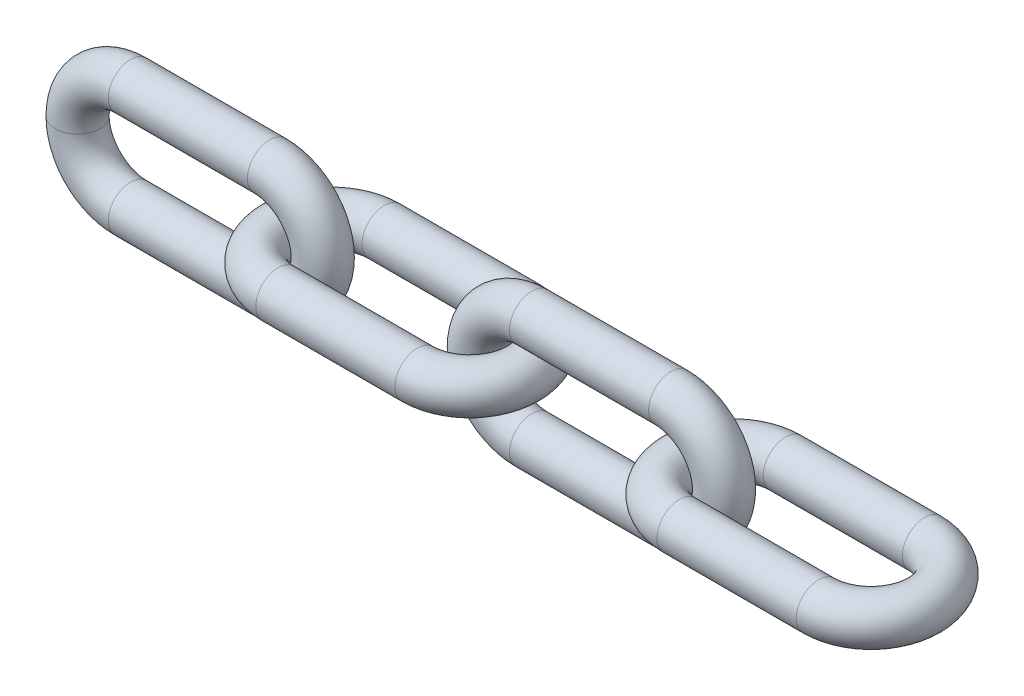
ISO-10303-21;
HEADER;
FILE_DESCRIPTION(('STEP AP214'),'2;1');
FILE_NAME('part.step','',(''),(''),'','','');
FILE_SCHEMA(('AUTOMOTIVE_DESIGN { 1 0 10303 214 1 1 1 1 }'));
ENDSEC;
DATA;
#1=APPLICATION_CONTEXT('core data for automotive mechanical design processes');
#2=APPLICATION_PROTOCOL_DEFINITION('international standard','automotive_design',2000,#1);
#3=PRODUCT_CONTEXT('',#1,'mechanical');
#4=PRODUCT('Part','Part','',(#3));
#5=PRODUCT_RELATED_PRODUCT_CATEGORY('part','',(#4));
#6=PRODUCT_DEFINITION_FORMATION('','',#4);
#7=PRODUCT_DEFINITION_CONTEXT('part definition',#1,'design');
#8=PRODUCT_DEFINITION('design','',#6,#7);
#9=PRODUCT_DEFINITION_SHAPE('','',#8);
#10=(LENGTH_UNIT() NAMED_UNIT(*) SI_UNIT(.MILLI.,.METRE.));
#11=(NAMED_UNIT(*) PLANE_ANGLE_UNIT() SI_UNIT($,.RADIAN.));
#12=(NAMED_UNIT(*) SI_UNIT($,.STERADIAN.) SOLID_ANGLE_UNIT());
#13=UNCERTAINTY_MEASURE_WITH_UNIT(LENGTH_MEASURE(1.E-05),#10,'distance_accuracy_value','');
#14=(GEOMETRIC_REPRESENTATION_CONTEXT(3) GLOBAL_UNCERTAINTY_ASSIGNED_CONTEXT((#13)) GLOBAL_UNIT_ASSIGNED_CONTEXT((#10,
#11,#12)) REPRESENTATION_CONTEXT('',''));
#15=CARTESIAN_POINT('',(0.,0.,0.));
#16=DIRECTION('',(0.,0.,1.));
#17=DIRECTION('',(1.,0.,0.));
#18=AXIS2_PLACEMENT_3D('',#15,#16,#17);
#19=CARTESIAN_POINT('',(83.566,0.,0.));
#20=DIRECTION('',(0.,0.999961923064166,0.00872653549903342));
#21=DIRECTION('',(-1.,0.,0.));
#22=AXIS2_PLACEMENT_3D('',#19,#20,#21);
#23=TOROIDAL_SURFACE('',#22,8.3312,3.5052);
#24=CARTESIAN_POINT('',(83.566,0.0727025125495473,-8.33088277343218));
#25=DIRECTION('',(-1.,0.,0.));
#26=DIRECTION('',(0.,-0.999961923064166,-0.00872653549903342));
#27=AXIS2_PLACEMENT_3D('',#24,#25,#26);
#28=CIRCLE('',#27,3.5052);
#29=CARTESIAN_POINT('',(83.566,0.103290764780759,-11.8359493061567));
#30=VERTEX_POINT('',#29);
#31=EDGE_CURVE('E11',#30,#30,#28,.T.);
#32=CARTESIAN_POINT('',(75.2348,0.,0.));
#33=DIRECTION('',(0.,-0.00872653549903342,0.999961923064166));
#34=DIRECTION('',(0.,-0.999961923064166,-0.00872653549903342));
#35=AXIS2_PLACEMENT_3D('',#32,#33,#34);
#36=CIRCLE('',#35,3.5052);
#37=CARTESIAN_POINT('',(71.7296,0.,0.));
#38=VERTEX_POINT('',#37);
#39=EDGE_CURVE('E69',#38,#38,#36,.T.);
#40=CARTESIAN_POINT('',(83.566,0.,0.));
#41=DIRECTION('',(0.,0.999961923064166,0.00872653549903342));
#42=DIRECTION('',(-1.,0.,0.));
#43=AXIS2_PLACEMENT_3D('',#40,#41,#42);
#44=CIRCLE('',#43,11.8364);
#45=EDGE_CURVE('',#30,#38,#44,.T.);
#46=ORIENTED_EDGE('',*,*,#31,.T.);
#47=ORIENTED_EDGE('',*,*,#39,.F.);
#48=ORIENTED_EDGE('',*,*,#45,.T.);
#49=ORIENTED_EDGE('',*,*,#45,.F.);
#50=EDGE_LOOP('',(#46,#48,#47,#49));
#51=FACE_BOUND('',#50,.T.);
#52=ADVANCED_FACE('F50',(#51),#23,.T.);
#53=CARTESIAN_POINT('',(105.41,0.0727025125495473,-8.33088277343218));
#54=DIRECTION('',(-1.,0.,0.));
#55=DIRECTION('',(0.,-0.999961923064166,-0.00872653549903342));
#56=AXIS2_PLACEMENT_3D('',#53,#54,#55);
#57=CYLINDRICAL_SURFACE('',#56,3.5052);
#58=ORIENTED_EDGE('',*,*,#31,.F.);
#59=EDGE_LOOP('',(#58));
#60=FACE_BOUND('',#59,.T.);
#61=CARTESIAN_POINT('',(105.41,0.0727025125495472,-8.33088277343218));
#62=DIRECTION('',(-1.,0.,0.));
#63=DIRECTION('',(0.,-0.999961923064166,-0.00872653549903342));
#64=AXIS2_PLACEMENT_3D('',#61,#62,#63);
#65=CIRCLE('',#64,3.5052);
#66=CARTESIAN_POINT('',(105.41,0.103290764780759,-11.8359493061567));
#67=VERTEX_POINT('',#66);
#68=EDGE_CURVE('E56',#67,#67,#65,.T.);
#69=ORIENTED_EDGE('',*,*,#68,.T.);
#70=EDGE_LOOP('',(#69));
#71=FACE_BOUND('',#70,.T.);
#72=ADVANCED_FACE('F76',(#60,#71),#57,.T.);
#73=CARTESIAN_POINT('',(105.41,0.,0.));
#74=DIRECTION('',(0.,0.999961923064166,0.00872653549903342));
#75=DIRECTION('',(-1.,0.,0.));
#76=AXIS2_PLACEMENT_3D('',#73,#74,#75);
#77=TOROIDAL_SURFACE('',#76,8.3312,3.5052);
#78=CARTESIAN_POINT('',(105.41,-0.0727025125495473,8.33088277343218));
#79=DIRECTION('',(1.,0.,0.));
#80=DIRECTION('',(0.,-0.999961923064166,-0.00872653549903342));
#81=AXIS2_PLACEMENT_3D('',#78,#79,#80);
#82=CIRCLE('',#81,3.5052);
#83=CARTESIAN_POINT('',(105.41,-0.103290764780759,11.8359493061567));
#84=VERTEX_POINT('',#83);
#85=EDGE_CURVE('E60',#84,#84,#82,.T.);
#86=CARTESIAN_POINT('',(105.41,0.,0.));
#87=DIRECTION('',(0.,0.999961923064166,0.00872653549903342));
#88=DIRECTION('',(-1.,0.,0.));
#89=AXIS2_PLACEMENT_3D('',#86,#87,#88);
#90=CIRCLE('',#89,11.8364);
#91=EDGE_CURVE('',#84,#67,#90,.T.);
#92=ORIENTED_EDGE('',*,*,#85,.T.);
#93=ORIENTED_EDGE('',*,*,#68,.F.);
#94=ORIENTED_EDGE('',*,*,#91,.T.);
#95=ORIENTED_EDGE('',*,*,#91,.F.);
#96=EDGE_LOOP('',(#92,#94,#93,#95));
#97=FACE_BOUND('',#96,.T.);
#98=ADVANCED_FACE('F80',(#97),#77,.T.);
#99=CARTESIAN_POINT('',(83.566,-0.0727025125495473,8.33088277343218));
#100=DIRECTION('',(1.,0.,0.));
#101=DIRECTION('',(0.,0.999961923064166,0.00872653549903342));
#102=AXIS2_PLACEMENT_3D('',#99,#100,#101);
#103=CYLINDRICAL_SURFACE('',#102,3.5052);
#104=ORIENTED_EDGE('',*,*,#85,.F.);
#105=EDGE_LOOP('',(#104));
#106=FACE_BOUND('',#105,.T.);
#107=CARTESIAN_POINT('',(83.566,-0.0727025125495473,8.33088277343218));
#108=DIRECTION('',(1.,0.,0.));
#109=DIRECTION('',(0.,-0.999961923064166,-0.00872653549903342));
#110=AXIS2_PLACEMENT_3D('',#107,#108,#109);
#111=CIRCLE('',#110,3.5052);
#112=CARTESIAN_POINT('',(83.566,-0.103290764780759,11.8359493061567));
#113=VERTEX_POINT('',#112);
#114=EDGE_CURVE('E64',#113,#113,#111,.T.);
#115=ORIENTED_EDGE('',*,*,#114,.T.);
#116=EDGE_LOOP('',(#115));
#117=FACE_BOUND('',#116,.T.);
#118=ADVANCED_FACE('F85',(#106,#117),#103,.T.);
#119=CARTESIAN_POINT('',(83.566,0.,0.));
#120=DIRECTION('',(0.,0.999961923064166,0.00872653549903342));
#121=DIRECTION('',(-1.,0.,0.));
#122=AXIS2_PLACEMENT_3D('',#119,#120,#121);
#123=TOROIDAL_SURFACE('',#122,8.3312,3.5052);
#124=CARTESIAN_POINT('',(83.566,0.,0.));
#125=DIRECTION('',(0.,0.999961923064166,0.00872653549903342));
#126=DIRECTION('',(-1.,0.,0.));
#127=AXIS2_PLACEMENT_3D('',#124,#125,#126);
#128=CIRCLE('',#127,11.8364);
#129=EDGE_CURVE('',#38,#113,#128,.T.);
#130=ORIENTED_EDGE('',*,*,#39,.T.);
#131=ORIENTED_EDGE('',*,*,#114,.F.);
#132=ORIENTED_EDGE('',*,*,#129,.T.);
#133=ORIENTED_EDGE('',*,*,#129,.F.);
#134=EDGE_LOOP('',(#130,#132,#131,#133));
#135=FACE_BOUND('',#134,.T.);
#136=ADVANCED_FACE('F73',(#135),#123,.T.);
#137=CLOSED_SHELL('',(#52,#72,#98,#118,#136));
#138=MANIFOLD_SOLID_BREP('B2',#137);
#139=CARTESIAN_POINT('',(20.574,0.,0.));
#140=DIRECTION('',(0.,0.999961923064166,0.00872653549903342));
#141=DIRECTION('',(-1.,0.,0.));
#142=AXIS2_PLACEMENT_3D('',#139,#140,#141);
#143=TOROIDAL_SURFACE('',#142,8.3312,3.5052);
#144=CARTESIAN_POINT('',(20.574,0.0727025125495473,-8.33088277343218));
#145=DIRECTION('',(-1.,0.,0.));
#146=DIRECTION('',(0.,-0.999961923064166,-0.00872653549903342));
#147=AXIS2_PLACEMENT_3D('',#144,#145,#146);
#148=CIRCLE('',#147,3.5052);
#149=CARTESIAN_POINT('',(20.574,0.103290764780759,-11.8359493061567));
#150=VERTEX_POINT('',#149);
#151=EDGE_CURVE('E49',#150,#150,#148,.T.);
#152=CARTESIAN_POINT('',(12.2428,0.,0.));
#153=DIRECTION('',(0.,-0.00872653549903342,0.999961923064166));
#154=DIRECTION('',(0.,-0.999961923064166,-0.00872653549903342));
#155=AXIS2_PLACEMENT_3D('',#152,#153,#154);
#156=CIRCLE('',#155,3.5052);
#157=CARTESIAN_POINT('',(8.7376,0.,0.));
#158=VERTEX_POINT('',#157);
#159=EDGE_CURVE('E167',#158,#158,#156,.T.);
#160=CARTESIAN_POINT('',(20.574,0.,0.));
#161=DIRECTION('',(0.,0.999961923064166,0.00872653549903342));
#162=DIRECTION('',(-1.,0.,0.));
#163=AXIS2_PLACEMENT_3D('',#160,#161,#162);
#164=CIRCLE('',#163,11.8364);
#165=EDGE_CURVE('',#150,#158,#164,.T.);
#166=ORIENTED_EDGE('',*,*,#151,.T.);
#167=ORIENTED_EDGE('',*,*,#159,.F.);
#168=ORIENTED_EDGE('',*,*,#165,.T.);
#169=ORIENTED_EDGE('',*,*,#165,.F.);
#170=EDGE_LOOP('',(#166,#168,#167,#169));
#171=FACE_BOUND('',#170,.T.);
#172=ADVANCED_FACE('F145',(#171),#143,.T.);
#173=CARTESIAN_POINT('',(42.418,0.0727025125495473,-8.33088277343218));
#174=DIRECTION('',(-1.,0.,0.));
#175=DIRECTION('',(0.,-0.999961923064166,-0.00872653549903342));
#176=AXIS2_PLACEMENT_3D('',#173,#174,#175);
#177=CYLINDRICAL_SURFACE('',#176,3.5052);
#178=ORIENTED_EDGE('',*,*,#151,.F.);
#179=EDGE_LOOP('',(#178));
#180=FACE_BOUND('',#179,.T.);
#181=CARTESIAN_POINT('',(42.418,0.0727025125495472,-8.33088277343218));
#182=DIRECTION('',(-1.,0.,0.));
#183=DIRECTION('',(0.,-0.999961923064166,-0.00872653549903342));
#184=AXIS2_PLACEMENT_3D('',#181,#182,#183);
#185=CIRCLE('',#184,3.5052);
#186=CARTESIAN_POINT('',(42.418,0.103290764780759,-11.8359493061567));
#187=VERTEX_POINT('',#186);
#188=EDGE_CURVE('E152',#187,#187,#185,.T.);
#189=ORIENTED_EDGE('',*,*,#188,.T.);
#190=EDGE_LOOP('',(#189));
#191=FACE_BOUND('',#190,.T.);
#192=ADVANCED_FACE('F174',(#180,#191),#177,.T.);
#193=CARTESIAN_POINT('',(42.418,0.,0.));
#194=DIRECTION('',(0.,0.999961923064166,0.00872653549903342));
#195=DIRECTION('',(-1.,0.,0.));
#196=AXIS2_PLACEMENT_3D('',#193,#194,#195);
#197=TOROIDAL_SURFACE('',#196,8.3312,3.5052);
#198=CARTESIAN_POINT('',(42.418,-0.0727025125495473,8.33088277343218));
#199=DIRECTION('',(1.,0.,0.));
#200=DIRECTION('',(0.,-0.999961923064166,-0.00872653549903342));
#201=AXIS2_PLACEMENT_3D('',#198,#199,#200);
#202=CIRCLE('',#201,3.5052);
#203=CARTESIAN_POINT('',(42.418,-0.103290764780759,11.8359493061567));
#204=VERTEX_POINT('',#203);
#205=EDGE_CURVE('E158',#204,#204,#202,.T.);
#206=CARTESIAN_POINT('',(42.418,0.,0.));
#207=DIRECTION('',(0.,0.999961923064166,0.00872653549903342));
#208=DIRECTION('',(-1.,0.,0.));
#209=AXIS2_PLACEMENT_3D('',#206,#207,#208);
#210=CIRCLE('',#209,11.8364);
#211=EDGE_CURVE('',#204,#187,#210,.T.);
#212=ORIENTED_EDGE('',*,*,#205,.T.);
#213=ORIENTED_EDGE('',*,*,#188,.F.);
#214=ORIENTED_EDGE('',*,*,#211,.T.);
#215=ORIENTED_EDGE('',*,*,#211,.F.);
#216=EDGE_LOOP('',(#212,#214,#213,#215));
#217=FACE_BOUND('',#216,.T.);
#218=ADVANCED_FACE('F178',(#217),#197,.T.);
#219=CARTESIAN_POINT('',(20.574,-0.0727025125495473,8.33088277343218));
#220=DIRECTION('',(1.,0.,0.));
#221=DIRECTION('',(0.,0.999961923064166,0.00872653549903342));
#222=AXIS2_PLACEMENT_3D('',#219,#220,#221);
#223=CYLINDRICAL_SURFACE('',#222,3.5052);
#224=ORIENTED_EDGE('',*,*,#205,.F.);
#225=EDGE_LOOP('',(#224));
#226=FACE_BOUND('',#225,.T.);
#227=CARTESIAN_POINT('',(20.574,-0.0727025125495473,8.33088277343218));
#228=DIRECTION('',(1.,0.,0.));
#229=DIRECTION('',(0.,-0.999961923064166,-0.00872653549903342));
#230=AXIS2_PLACEMENT_3D('',#227,#228,#229);
#231=CIRCLE('',#230,3.5052);
#232=CARTESIAN_POINT('',(20.574,-0.103290764780759,11.8359493061567));
#233=VERTEX_POINT('',#232);
#234=EDGE_CURVE('E162',#233,#233,#231,.T.);
#235=ORIENTED_EDGE('',*,*,#234,.T.);
#236=EDGE_LOOP('',(#235));
#237=FACE_BOUND('',#236,.T.);
#238=ADVANCED_FACE('F183',(#226,#237),#223,.T.);
#239=CARTESIAN_POINT('',(20.574,0.,0.));
#240=DIRECTION('',(0.,0.999961923064166,0.00872653549903342));
#241=DIRECTION('',(-1.,0.,0.));
#242=AXIS2_PLACEMENT_3D('',#239,#240,#241);
#243=TOROIDAL_SURFACE('',#242,8.3312,3.5052);
#244=CARTESIAN_POINT('',(20.574,0.,0.));
#245=DIRECTION('',(0.,0.999961923064166,0.00872653549903342));
#246=DIRECTION('',(-1.,0.,0.));
#247=AXIS2_PLACEMENT_3D('',#244,#245,#246);
#248=CIRCLE('',#247,11.8364);
#249=EDGE_CURVE('',#158,#233,#248,.T.);
#250=ORIENTED_EDGE('',*,*,#159,.T.);
#251=ORIENTED_EDGE('',*,*,#234,.F.);
#252=ORIENTED_EDGE('',*,*,#249,.T.);
#253=ORIENTED_EDGE('',*,*,#249,.F.);
#254=EDGE_LOOP('',(#250,#252,#251,#253));
#255=FACE_BOUND('',#254,.T.);
#256=ADVANCED_FACE('F171',(#255),#243,.T.);
#257=CLOSED_SHELL('',(#172,#192,#218,#238,#256));
#258=MANIFOLD_SOLID_BREP('B6',#257);
#259=CARTESIAN_POINT('',(52.07,0.,0.));
#260=DIRECTION('',(0.,0.,-1.));
#261=DIRECTION('',(-1.,0.,0.));
#262=AXIS2_PLACEMENT_3D('',#259,#260,#261);
#263=TOROIDAL_SURFACE('',#262,8.3312,3.5052);
#264=CARTESIAN_POINT('',(52.07,-8.3312,0.));
#265=DIRECTION('',(-1.,0.,0.));
#266=DIRECTION('',(0.,0.,1.));
#267=AXIS2_PLACEMENT_3D('',#264,#265,#266);
#268=CIRCLE('',#267,3.5052);
#269=CARTESIAN_POINT('',(52.07,-11.8364,0.));
#270=VERTEX_POINT('',#269);
#271=EDGE_CURVE('E144',#270,#270,#268,.T.);
#272=CARTESIAN_POINT('',(43.7388,0.,0.));
#273=DIRECTION('',(0.,1.,0.));
#274=DIRECTION('',(0.,0.,1.));
#275=AXIS2_PLACEMENT_3D('',#272,#273,#274);
#276=CIRCLE('',#275,3.5052);
#277=CARTESIAN_POINT('',(40.2336,0.,0.));
#278=VERTEX_POINT('',#277);
#279=EDGE_CURVE('E263',#278,#278,#276,.T.);
#280=CARTESIAN_POINT('',(52.07,0.,0.));
#281=DIRECTION('',(0.,0.,-1.));
#282=DIRECTION('',(-1.,0.,0.));
#283=AXIS2_PLACEMENT_3D('',#280,#281,#282);
#284=CIRCLE('',#283,11.8364);
#285=EDGE_CURVE('',#270,#278,#284,.T.);
#286=ORIENTED_EDGE('',*,*,#271,.T.);
#287=ORIENTED_EDGE('',*,*,#279,.F.);
#288=ORIENTED_EDGE('',*,*,#285,.T.);
#289=ORIENTED_EDGE('',*,*,#285,.F.);
#290=EDGE_LOOP('',(#286,#288,#287,#289));
#291=FACE_BOUND('',#290,.T.);
#292=ADVANCED_FACE('F244',(#291),#263,.T.);
#293=CARTESIAN_POINT('',(73.914,-8.3312,0.));
#294=DIRECTION('',(-1.,0.,0.));
#295=DIRECTION('',(0.,0.,1.));
#296=AXIS2_PLACEMENT_3D('',#293,#294,#295);
#297=CYLINDRICAL_SURFACE('',#296,3.5052);
#298=ORIENTED_EDGE('',*,*,#271,.F.);
#299=EDGE_LOOP('',(#298));
#300=FACE_BOUND('',#299,.T.);
#301=CARTESIAN_POINT('',(73.914,-8.3312,0.));
#302=DIRECTION('',(-1.,0.,0.));
#303=DIRECTION('',(0.,0.,1.));
#304=AXIS2_PLACEMENT_3D('',#301,#302,#303);
#305=CIRCLE('',#304,3.5052);
#306=CARTESIAN_POINT('',(73.914,-11.8364,0.));
#307=VERTEX_POINT('',#306);
#308=EDGE_CURVE('E250',#307,#307,#305,.T.);
#309=ORIENTED_EDGE('',*,*,#308,.T.);
#310=EDGE_LOOP('',(#309));
#311=FACE_BOUND('',#310,.T.);
#312=ADVANCED_FACE('F270',(#300,#311),#297,.T.);
#313=CARTESIAN_POINT('',(73.914,0.,0.));
#314=DIRECTION('',(0.,0.,-1.));
#315=DIRECTION('',(-1.,0.,0.));
#316=AXIS2_PLACEMENT_3D('',#313,#314,#315);
#317=TOROIDAL_SURFACE('',#316,8.3312,3.5052);
#318=CARTESIAN_POINT('',(73.914,8.3312,0.));
#319=DIRECTION('',(1.,0.,0.));
#320=DIRECTION('',(0.,0.,1.));
#321=AXIS2_PLACEMENT_3D('',#318,#319,#320);
#322=CIRCLE('',#321,3.5052);
#323=CARTESIAN_POINT('',(73.914,11.8364,0.));
#324=VERTEX_POINT('',#323);
#325=EDGE_CURVE('E254',#324,#324,#322,.T.);
#326=CARTESIAN_POINT('',(73.914,0.,0.));
#327=DIRECTION('',(0.,0.,-1.));
#328=DIRECTION('',(-1.,0.,0.));
#329=AXIS2_PLACEMENT_3D('',#326,#327,#328);
#330=CIRCLE('',#329,11.8364);
#331=EDGE_CURVE('',#324,#307,#330,.T.);
#332=ORIENTED_EDGE('',*,*,#325,.T.);
#333=ORIENTED_EDGE('',*,*,#308,.F.);
#334=ORIENTED_EDGE('',*,*,#331,.T.);
#335=ORIENTED_EDGE('',*,*,#331,.F.);
#336=EDGE_LOOP('',(#332,#334,#333,#335));
#337=FACE_BOUND('',#336,.T.);
#338=ADVANCED_FACE('F274',(#337),#317,.T.);
#339=CARTESIAN_POINT('',(52.07,8.3312,0.));
#340=DIRECTION('',(1.,0.,0.));
#341=DIRECTION('',(0.,0.,-1.));
#342=AXIS2_PLACEMENT_3D('',#339,#340,#341);
#343=CYLINDRICAL_SURFACE('',#342,3.5052);
#344=ORIENTED_EDGE('',*,*,#325,.F.);
#345=EDGE_LOOP('',(#344));
#346=FACE_BOUND('',#345,.T.);
#347=CARTESIAN_POINT('',(52.07,8.3312,0.));
#348=DIRECTION('',(1.,0.,0.));
#349=DIRECTION('',(0.,0.,1.));
#350=AXIS2_PLACEMENT_3D('',#347,#348,#349);
#351=CIRCLE('',#350,3.5052);
#352=CARTESIAN_POINT('',(52.07,11.8364,0.));
#353=VERTEX_POINT('',#352);
#354=EDGE_CURVE('E258',#353,#353,#351,.T.);
#355=ORIENTED_EDGE('',*,*,#354,.T.);
#356=EDGE_LOOP('',(#355));
#357=FACE_BOUND('',#356,.T.);
#358=ADVANCED_FACE('F279',(#346,#357),#343,.T.);
#359=CARTESIAN_POINT('',(52.07,0.,0.));
#360=DIRECTION('',(0.,0.,-1.));
#361=DIRECTION('',(-1.,0.,0.));
#362=AXIS2_PLACEMENT_3D('',#359,#360,#361);
#363=TOROIDAL_SURFACE('',#362,8.3312,3.5052);
#364=CARTESIAN_POINT('',(52.07,0.,0.));
#365=DIRECTION('',(0.,0.,-1.));
#366=DIRECTION('',(-1.,0.,0.));
#367=AXIS2_PLACEMENT_3D('',#364,#365,#366);
#368=CIRCLE('',#367,11.8364);
#369=EDGE_CURVE('',#278,#353,#368,.T.);
#370=ORIENTED_EDGE('',*,*,#279,.T.);
#371=ORIENTED_EDGE('',*,*,#354,.F.);
#372=ORIENTED_EDGE('',*,*,#369,.T.);
#373=ORIENTED_EDGE('',*,*,#369,.F.);
#374=EDGE_LOOP('',(#370,#372,#371,#373));
#375=FACE_BOUND('',#374,.T.);
#376=ADVANCED_FACE('F267',(#375),#363,.T.);
#377=CLOSED_SHELL('',(#292,#312,#338,#358,#376));
#378=MANIFOLD_SOLID_BREP('B44',#377);
#379=CARTESIAN_POINT('',(-10.922,0.,0.));
#380=DIRECTION('',(0.,0.,-1.));
#381=DIRECTION('',(-1.,0.,0.));
#382=AXIS2_PLACEMENT_3D('',#379,#380,#381);
#383=TOROIDAL_SURFACE('',#382,8.3312,3.5052);
#384=CARTESIAN_POINT('',(-10.922,-8.3312,0.));
#385=DIRECTION('',(-1.,0.,0.));
#386=DIRECTION('',(0.,0.,1.));
#387=AXIS2_PLACEMENT_3D('',#384,#385,#386);
#388=CIRCLE('',#387,3.5052);
#389=CARTESIAN_POINT('',(-10.922,-11.8364,0.));
#390=VERTEX_POINT('',#389);
#391=EDGE_CURVE('E243',#390,#390,#388,.T.);
#392=CARTESIAN_POINT('',(-19.2532,0.,0.));
#393=DIRECTION('',(0.,1.,0.));
#394=DIRECTION('',(0.,0.,1.));
#395=AXIS2_PLACEMENT_3D('',#392,#393,#394);
#396=CIRCLE('',#395,3.5052);
#397=CARTESIAN_POINT('',(-22.7584,0.,0.));
#398=VERTEX_POINT('',#397);
#399=EDGE_CURVE('E351',#398,#398,#396,.T.);
#400=CARTESIAN_POINT('',(-10.922,0.,0.));
#401=DIRECTION('',(0.,0.,-1.));
#402=DIRECTION('',(-1.,0.,0.));
#403=AXIS2_PLACEMENT_3D('',#400,#401,#402);
#404=CIRCLE('',#403,11.8364);
#405=EDGE_CURVE('',#390,#398,#404,.T.);
#406=ORIENTED_EDGE('',*,*,#391,.T.);
#407=ORIENTED_EDGE('',*,*,#399,.F.);
#408=ORIENTED_EDGE('',*,*,#405,.T.);
#409=ORIENTED_EDGE('',*,*,#405,.F.);
#410=EDGE_LOOP('',(#406,#408,#407,#409));
#411=FACE_BOUND('',#410,.T.);
#412=ADVANCED_FACE('F331',(#411),#383,.T.);
#413=CARTESIAN_POINT('',(10.922,-8.3312,0.));
#414=DIRECTION('',(-1.,0.,0.));
#415=DIRECTION('',(0.,0.,1.));
#416=AXIS2_PLACEMENT_3D('',#413,#414,#415);
#417=CYLINDRICAL_SURFACE('',#416,3.5052);
#418=ORIENTED_EDGE('',*,*,#391,.F.);
#419=EDGE_LOOP('',(#418));
#420=FACE_BOUND('',#419,.T.);
#421=CARTESIAN_POINT('',(10.922,-8.3312,0.));
#422=DIRECTION('',(-1.,0.,0.));
#423=DIRECTION('',(0.,0.,1.));
#424=AXIS2_PLACEMENT_3D('',#421,#422,#423);
#425=CIRCLE('',#424,3.5052);
#426=CARTESIAN_POINT('',(10.922,-11.8364,0.));
#427=VERTEX_POINT('',#426);
#428=EDGE_CURVE('E337',#427,#427,#425,.T.);
#429=ORIENTED_EDGE('',*,*,#428,.T.);
#430=EDGE_LOOP('',(#429));
#431=FACE_BOUND('',#430,.T.);
#432=ADVANCED_FACE('F358',(#420,#431),#417,.T.);
#433=CARTESIAN_POINT('',(10.922,0.,0.));
#434=DIRECTION('',(0.,0.,-1.));
#435=DIRECTION('',(-1.,0.,0.));
#436=AXIS2_PLACEMENT_3D('',#433,#434,#435);
#437=TOROIDAL_SURFACE('',#436,8.3312,3.5052);
#438=CARTESIAN_POINT('',(10.922,8.3312,0.));
#439=DIRECTION('',(1.,0.,0.));
#440=DIRECTION('',(0.,0.,1.));
#441=AXIS2_PLACEMENT_3D('',#438,#439,#440);
#442=CIRCLE('',#441,3.5052);
#443=CARTESIAN_POINT('',(10.922,11.8364,0.));
#444=VERTEX_POINT('',#443);
#445=EDGE_CURVE('E341',#444,#444,#442,.T.);
#446=CARTESIAN_POINT('',(10.922,0.,0.));
#447=DIRECTION('',(0.,0.,-1.));
#448=DIRECTION('',(-1.,0.,0.));
#449=AXIS2_PLACEMENT_3D('',#446,#447,#448);
#450=CIRCLE('',#449,11.8364);
#451=EDGE_CURVE('',#444,#427,#450,.T.);
#452=ORIENTED_EDGE('',*,*,#445,.T.);
#453=ORIENTED_EDGE('',*,*,#428,.F.);
#454=ORIENTED_EDGE('',*,*,#451,.T.);
#455=ORIENTED_EDGE('',*,*,#451,.F.);
#456=EDGE_LOOP('',(#452,#454,#453,#455));
#457=FACE_BOUND('',#456,.T.);
#458=ADVANCED_FACE('F362',(#457),#437,.T.);
#459=CARTESIAN_POINT('',(-10.922,8.3312,0.));
#460=DIRECTION('',(1.,0.,0.));
#461=DIRECTION('',(0.,0.,-1.));
#462=AXIS2_PLACEMENT_3D('',#459,#460,#461);
#463=CYLINDRICAL_SURFACE('',#462,3.5052);
#464=ORIENTED_EDGE('',*,*,#445,.F.);
#465=EDGE_LOOP('',(#464));
#466=FACE_BOUND('',#465,.T.);
#467=CARTESIAN_POINT('',(-10.922,8.3312,0.));
#468=DIRECTION('',(1.,0.,0.));
#469=DIRECTION('',(0.,0.,1.));
#470=AXIS2_PLACEMENT_3D('',#467,#468,#469);
#471=CIRCLE('',#470,3.5052);
#472=CARTESIAN_POINT('',(-10.922,11.8364,0.));
#473=VERTEX_POINT('',#472);
#474=EDGE_CURVE('E346',#473,#473,#471,.T.);
#475=ORIENTED_EDGE('',*,*,#474,.T.);
#476=EDGE_LOOP('',(#475));
#477=FACE_BOUND('',#476,.T.);
#478=ADVANCED_FACE('F367',(#466,#477),#463,.T.);
#479=CARTESIAN_POINT('',(-10.922,0.,0.));
#480=DIRECTION('',(0.,0.,-1.));
#481=DIRECTION('',(-1.,0.,0.));
#482=AXIS2_PLACEMENT_3D('',#479,#480,#481);
#483=TOROIDAL_SURFACE('',#482,8.3312,3.5052);
#484=CARTESIAN_POINT('',(-10.922,0.,0.));
#485=DIRECTION('',(0.,0.,-1.));
#486=DIRECTION('',(-1.,0.,0.));
#487=AXIS2_PLACEMENT_3D('',#484,#485,#486);
#488=CIRCLE('',#487,11.8364);
#489=EDGE_CURVE('',#398,#473,#488,.T.);
#490=ORIENTED_EDGE('',*,*,#399,.T.);
#491=ORIENTED_EDGE('',*,*,#474,.F.);
#492=ORIENTED_EDGE('',*,*,#489,.T.);
#493=ORIENTED_EDGE('',*,*,#489,.F.);
#494=EDGE_LOOP('',(#490,#492,#491,#493));
#495=FACE_BOUND('',#494,.T.);
#496=ADVANCED_FACE('F355',(#495),#483,.T.);
#497=CLOSED_SHELL('',(#412,#432,#458,#478,#496));
#498=MANIFOLD_SOLID_BREP('B139',#497);
#499=ADVANCED_BREP_SHAPE_REPRESENTATION('',(#18,#138,#258,#378,#498),#14);
#500=SHAPE_DEFINITION_REPRESENTATION(#9,#499);
ENDSEC;
END-ISO-10303-21;
